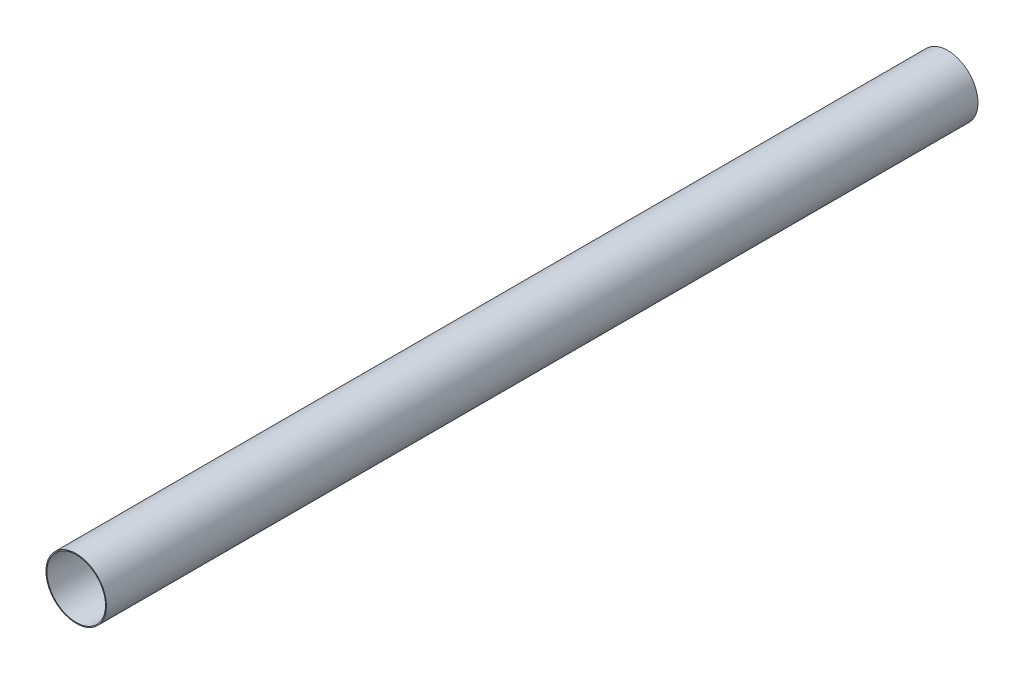
ISO-10303-21;
HEADER;
FILE_DESCRIPTION(('STEP AP214'),'2;1');
FILE_NAME('part.step','',(''),(''),'','','');
FILE_SCHEMA(('AUTOMOTIVE_DESIGN { 1 0 10303 214 1 1 1 1 }'));
ENDSEC;
DATA;
#1=APPLICATION_CONTEXT('core data for automotive mechanical design processes');
#2=APPLICATION_PROTOCOL_DEFINITION('international standard','automotive_design',2000,#1);
#3=PRODUCT_CONTEXT('',#1,'mechanical');
#4=PRODUCT('Part','Part','',(#3));
#5=PRODUCT_RELATED_PRODUCT_CATEGORY('part','',(#4));
#6=PRODUCT_DEFINITION_FORMATION('','',#4);
#7=PRODUCT_DEFINITION_CONTEXT('part definition',#1,'design');
#8=PRODUCT_DEFINITION('design','',#6,#7);
#9=PRODUCT_DEFINITION_SHAPE('','',#8);
#10=(LENGTH_UNIT() NAMED_UNIT(*) SI_UNIT(.MILLI.,.METRE.));
#11=(NAMED_UNIT(*) PLANE_ANGLE_UNIT() SI_UNIT($,.RADIAN.));
#12=(NAMED_UNIT(*) SI_UNIT($,.STERADIAN.) SOLID_ANGLE_UNIT());
#13=UNCERTAINTY_MEASURE_WITH_UNIT(LENGTH_MEASURE(1.E-05),#10,'distance_accuracy_value','');
#14=(GEOMETRIC_REPRESENTATION_CONTEXT(3) GLOBAL_UNCERTAINTY_ASSIGNED_CONTEXT((#13)) GLOBAL_UNIT_ASSIGNED_CONTEXT((#10,
#11,#12)) REPRESENTATION_CONTEXT('',''));
#15=CARTESIAN_POINT('',(0.,0.,0.));
#16=DIRECTION('',(0.,0.,1.));
#17=DIRECTION('',(1.,0.,0.));
#18=AXIS2_PLACEMENT_3D('',#15,#16,#17);
#19=CARTESIAN_POINT('',(0.,0.,1473.2));
#20=DIRECTION('',(0.,0.,1.));
#21=DIRECTION('',(1.,0.,0.));
#22=AXIS2_PLACEMENT_3D('',#19,#20,#21);
#23=PLANE('',#22);
#24=CARTESIAN_POINT('',(0.,0.,1473.2));
#25=DIRECTION('',(0.,0.,1.));
#26=DIRECTION('',(1.,0.,0.));
#27=AXIS2_PLACEMENT_3D('',#24,#25,#26);
#28=CIRCLE('',#27,51.1175);
#29=CARTESIAN_POINT('',(51.1175,0.,1473.2));
#30=VERTEX_POINT('',#29);
#31=EDGE_CURVE('E10',#30,#30,#28,.T.);
#32=ORIENTED_EDGE('',*,*,#31,.T.);
#33=EDGE_LOOP('',(#32));
#34=FACE_BOUND('',#33,.T.);
#35=CARTESIAN_POINT('',(0.,0.,1473.2));
#36=DIRECTION('',(0.,0.,1.));
#37=DIRECTION('',(1.,0.,0.));
#38=AXIS2_PLACEMENT_3D('',#35,#36,#37);
#39=CIRCLE('',#38,49.53);
#40=CARTESIAN_POINT('',(49.53,0.,1473.2));
#41=VERTEX_POINT('',#40);
#42=EDGE_CURVE('E41',#41,#41,#39,.T.);
#43=ORIENTED_EDGE('',*,*,#42,.F.);
#44=EDGE_LOOP('',(#43));
#45=FACE_BOUND('',#44,.T.);
#46=ADVANCED_FACE('F30',(#34,#45),#23,.T.);
#47=CARTESIAN_POINT('',(0.,0.,0.));
#48=DIRECTION('',(0.,0.,1.));
#49=DIRECTION('',(1.,0.,0.));
#50=AXIS2_PLACEMENT_3D('',#47,#48,#49);
#51=PLANE('',#50);
#52=CARTESIAN_POINT('',(0.,0.,0.));
#53=DIRECTION('',(0.,0.,1.));
#54=DIRECTION('',(1.,0.,0.));
#55=AXIS2_PLACEMENT_3D('',#52,#53,#54);
#56=CIRCLE('',#55,51.1175);
#57=CARTESIAN_POINT('',(51.1175,0.,0.));
#58=VERTEX_POINT('',#57);
#59=EDGE_CURVE('E34',#58,#58,#56,.T.);
#60=ORIENTED_EDGE('',*,*,#59,.F.);
#61=EDGE_LOOP('',(#60));
#62=FACE_BOUND('',#61,.T.);
#63=CARTESIAN_POINT('',(0.,0.,0.));
#64=DIRECTION('',(0.,0.,1.));
#65=DIRECTION('',(1.,0.,0.));
#66=AXIS2_PLACEMENT_3D('',#63,#64,#65);
#67=CIRCLE('',#66,49.53);
#68=CARTESIAN_POINT('',(49.53,0.,0.));
#69=VERTEX_POINT('',#68);
#70=EDGE_CURVE('E43',#69,#69,#67,.T.);
#71=ORIENTED_EDGE('',*,*,#70,.T.);
#72=EDGE_LOOP('',(#71));
#73=FACE_BOUND('',#72,.T.);
#74=ADVANCED_FACE('F53',(#62,#73),#51,.F.);
#75=CARTESIAN_POINT('',(0.,0.,1473.2));
#76=DIRECTION('',(0.,0.,-1.));
#77=DIRECTION('',(-1.,0.,0.));
#78=AXIS2_PLACEMENT_3D('',#75,#76,#77);
#79=CYLINDRICAL_SURFACE('',#78,51.1175);
#80=ORIENTED_EDGE('',*,*,#31,.F.);
#81=EDGE_LOOP('',(#80));
#82=FACE_BOUND('',#81,.T.);
#83=ORIENTED_EDGE('',*,*,#59,.T.);
#84=EDGE_LOOP('',(#83));
#85=FACE_BOUND('',#84,.T.);
#86=ADVANCED_FACE('F32',(#82,#85),#79,.T.);
#87=CARTESIAN_POINT('',(0.,0.,1473.2));
#88=DIRECTION('',(0.,0.,-1.));
#89=DIRECTION('',(-1.,0.,0.));
#90=AXIS2_PLACEMENT_3D('',#87,#88,#89);
#91=CYLINDRICAL_SURFACE('',#90,49.53);
#92=ORIENTED_EDGE('',*,*,#42,.T.);
#93=EDGE_LOOP('',(#92));
#94=FACE_BOUND('',#93,.T.);
#95=ORIENTED_EDGE('',*,*,#70,.F.);
#96=EDGE_LOOP('',(#95));
#97=FACE_BOUND('',#96,.T.);
#98=ADVANCED_FACE('F49',(#94,#97),#91,.F.);
#99=CLOSED_SHELL('',(#46,#74,#86,#98));
#100=MANIFOLD_SOLID_BREP('B2',#99);
#101=ADVANCED_BREP_SHAPE_REPRESENTATION('',(#18,#100),#14);
#102=SHAPE_DEFINITION_REPRESENTATION(#9,#101);
ENDSEC;
END-ISO-10303-21;
